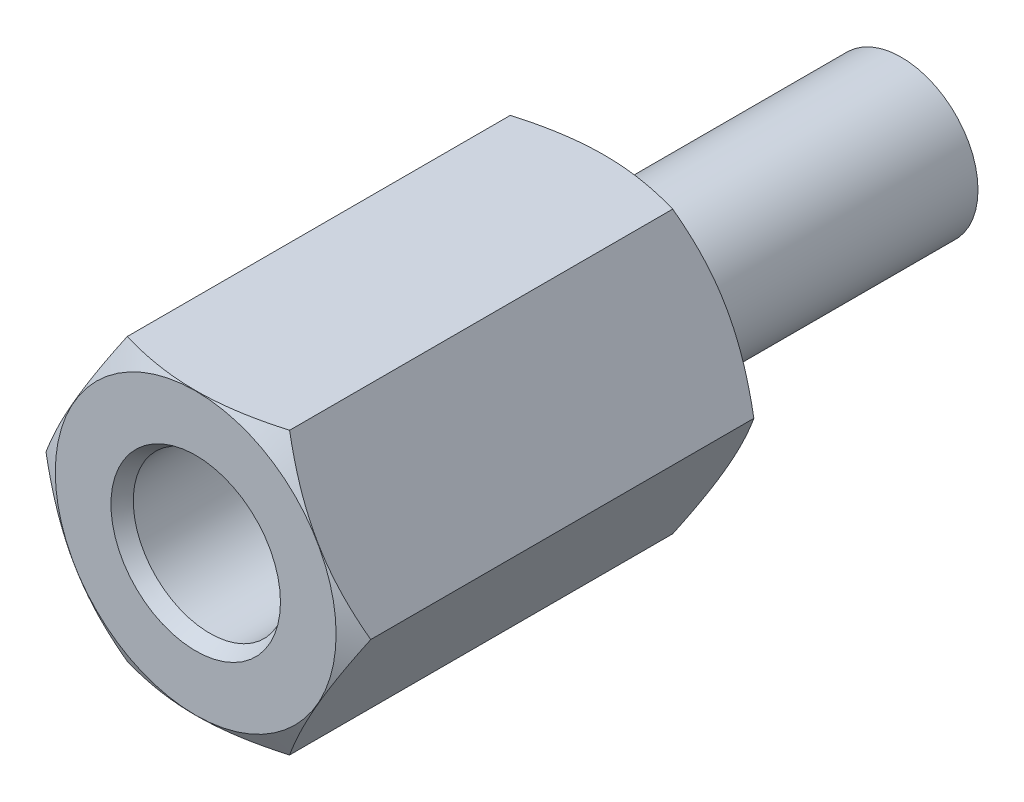
ISO-10303-21;
HEADER;
FILE_DESCRIPTION(('STEP AP214'),'2;1');
FILE_NAME('part.step','',(''),(''),'','','');
FILE_SCHEMA(('AUTOMOTIVE_DESIGN { 1 0 10303 214 1 1 1 1 }'));
ENDSEC;
DATA;
#1=APPLICATION_CONTEXT('core data for automotive mechanical design processes');
#2=APPLICATION_PROTOCOL_DEFINITION('international standard','automotive_design',2000,#1);
#3=PRODUCT_CONTEXT('',#1,'mechanical');
#4=PRODUCT('Part','Part','',(#3));
#5=PRODUCT_RELATED_PRODUCT_CATEGORY('part','',(#4));
#6=PRODUCT_DEFINITION_FORMATION('','',#4);
#7=PRODUCT_DEFINITION_CONTEXT('part definition',#1,'design');
#8=PRODUCT_DEFINITION('design','',#6,#7);
#9=PRODUCT_DEFINITION_SHAPE('','',#8);
#10=(LENGTH_UNIT() NAMED_UNIT(*) SI_UNIT(.MILLI.,.METRE.));
#11=(NAMED_UNIT(*) PLANE_ANGLE_UNIT() SI_UNIT($,.RADIAN.));
#12=(NAMED_UNIT(*) SI_UNIT($,.STERADIAN.) SOLID_ANGLE_UNIT());
#13=UNCERTAINTY_MEASURE_WITH_UNIT(LENGTH_MEASURE(1.E-05),#10,'distance_accuracy_value','');
#14=(GEOMETRIC_REPRESENTATION_CONTEXT(3) GLOBAL_UNCERTAINTY_ASSIGNED_CONTEXT((#13)) GLOBAL_UNIT_ASSIGNED_CONTEXT((#10,
#11,#12)) REPRESENTATION_CONTEXT('',''));
#15=CARTESIAN_POINT('',(0.,0.,0.));
#16=DIRECTION('',(0.,0.,1.));
#17=DIRECTION('',(1.,0.,0.));
#18=AXIS2_PLACEMENT_3D('',#15,#16,#17);
#19=CARTESIAN_POINT('',(0.,0.,5.58690872450008));
#20=DIRECTION('',(0.,0.,1.));
#21=DIRECTION('',(1.,0.,0.));
#22=AXIS2_PLACEMENT_3D('',#19,#20,#21);
#23=CONICAL_SURFACE('',#22,3.,1.047197551197);
#24=CARTESIAN_POINT('',(0.,0.,5.58690872450008));
#25=DIRECTION('',(0.,0.,1.));
#26=DIRECTION('',(1.,0.,0.));
#27=AXIS2_PLACEMENT_3D('',#24,#25,#26);
#28=CIRCLE('',#27,3.);
#29=CARTESIAN_POINT('',(3.00000000000009,0.,5.58690872450008));
#30=VERTEX_POINT('',#29);
#31=EDGE_CURVE('P0_E53',#30,#30,#28,.T.);
#32=ORIENTED_EDGE('',*,*,#31,.T.);
#33=DIRECTION('',(-0.866025403784329,0.,-0.50000000000019));
#34=VECTOR('',#33,1.);
#35=CARTESIAN_POINT('',(3.00000000000009,0.,5.58690872450008));
#36=LINE('',#35,#34);
#37=CARTESIAN_POINT('',(0.,0.,3.85485791693208));
#38=VERTEX_POINT('',#37);
#39=EDGE_CURVE('P0_E11',#30,#38,#36,.T.);
#40=ORIENTED_EDGE('',*,*,#39,.T.);
#41=ORIENTED_EDGE('',*,*,#39,.F.);
#42=EDGE_LOOP('',(#32,#40,#41));
#43=FACE_BOUND('',#42,.T.);
#44=ADVANCED_FACE('P0_F43',(#43),#23,.F.);
#45=CARTESIAN_POINT('',(0.,0.,-14.4130912754999));
#46=DIRECTION('',(0.,0.,1.));
#47=DIRECTION('',(1.,0.,0.));
#48=AXIS2_PLACEMENT_3D('',#45,#46,#47);
#49=PLANE('',#48);
#50=CARTESIAN_POINT('',(0.,0.,-14.4130912754999));
#51=DIRECTION('',(0.,0.,1.));
#52=DIRECTION('',(1.,0.,0.));
#53=AXIS2_PLACEMENT_3D('',#50,#51,#52);
#54=CIRCLE('',#53,2.38);
#55=CARTESIAN_POINT('',(2.38000000000009,0.,-14.4130912754999));
#56=VERTEX_POINT('',#55);
#57=EDGE_CURVE('P0_E218',#56,#56,#54,.T.);
#58=ORIENTED_EDGE('',*,*,#57,.F.);
#59=EDGE_LOOP('',(#58));
#60=FACE_BOUND('',#59,.T.);
#61=ADVANCED_FACE('P0_F275',(#60),#49,.F.);
#62=CARTESIAN_POINT('',(0.,0.,13.0326524660801));
#63=DIRECTION('',(0.,0.,-1.));
#64=DIRECTION('',(1.,0.,0.));
#65=AXIS2_PLACEMENT_3D('',#62,#63,#64);
#66=CYLINDRICAL_SURFACE('',#65,3.);
#67=CARTESIAN_POINT('',(0.,0.,13.0326524660801));
#68=DIRECTION('',(0.,0.,1.));
#69=DIRECTION('',(1.,0.,0.));
#70=AXIS2_PLACEMENT_3D('',#67,#68,#69);
#71=CIRCLE('',#70,3.);
#72=CARTESIAN_POINT('',(3.00000000000009,0.,13.0326524660801));
#73=VERTEX_POINT('',#72);
#74=EDGE_CURVE('P0_E223',#73,#73,#71,.T.);
#75=ORIENTED_EDGE('',*,*,#74,.T.);
#76=DIRECTION('',(0.,0.,-1.));
#77=VECTOR('',#76,1.);
#78=CARTESIAN_POINT('',(3.00000000000009,0.,13.0326524660801));
#79=LINE('',#78,#77);
#80=EDGE_CURVE('P0_E203',#73,#30,#79,.T.);
#81=ORIENTED_EDGE('',*,*,#80,.T.);
#82=ORIENTED_EDGE('',*,*,#31,.F.);
#83=ORIENTED_EDGE('',*,*,#80,.F.);
#84=EDGE_LOOP('',(#75,#81,#82,#83));
#85=FACE_BOUND('',#84,.T.);
#86=ADVANCED_FACE('P0_F277',(#85),#66,.F.);
#87=CARTESIAN_POINT('',(0.,0.,-14.4130912754999));
#88=DIRECTION('',(0.,0.,1.));
#89=DIRECTION('',(1.,0.,0.));
#90=AXIS2_PLACEMENT_3D('',#87,#88,#89);
#91=CONICAL_SURFACE('',#90,2.38,1.047197551197);
#92=ORIENTED_EDGE('',*,*,#57,.T.);
#93=DIRECTION('',(0.866025403784329,0.,0.50000000000019));
#94=VECTOR('',#93,1.);
#95=CARTESIAN_POINT('',(2.38000000000009,0.,-14.4130912754999));
#96=LINE('',#95,#94);
#97=CARTESIAN_POINT('',(3.00000000000009,0.,-14.0551341086019));
#98=VERTEX_POINT('',#97);
#99=EDGE_CURVE('P0_E77',#56,#98,#96,.T.);
#100=ORIENTED_EDGE('',*,*,#99,.T.);
#101=CARTESIAN_POINT('',(0.,0.,-14.0551341086019));
#102=DIRECTION('',(0.,0.,1.));
#103=DIRECTION('',(1.,0.,0.));
#104=AXIS2_PLACEMENT_3D('',#101,#102,#103);
#105=CIRCLE('',#104,3.);
#106=EDGE_CURVE('P0_E229',#98,#98,#105,.T.);
#107=ORIENTED_EDGE('',*,*,#106,.F.);
#108=ORIENTED_EDGE('',*,*,#99,.F.);
#109=EDGE_LOOP('',(#92,#100,#107,#108));
#110=FACE_BOUND('',#109,.T.);
#111=ADVANCED_FACE('P0_F272',(#110),#91,.T.);
#112=CARTESIAN_POINT('',(0.,0.,13.5869087245001));
#113=DIRECTION('',(0.,0.,1.));
#114=DIRECTION('',(1.,0.,0.));
#115=AXIS2_PLACEMENT_3D('',#112,#113,#114);
#116=CONICAL_SURFACE('',#115,3.32,0.523598775599);
#117=CARTESIAN_POINT('',(0.,0.,13.5869087245001));
#118=DIRECTION('',(0.,0.,1.));
#119=DIRECTION('',(1.,0.,0.));
#120=AXIS2_PLACEMENT_3D('',#117,#118,#119);
#121=CIRCLE('',#120,3.32);
#122=CARTESIAN_POINT('',(3.32000000000009,0.,13.5869087245001));
#123=VERTEX_POINT('',#122);
#124=EDGE_CURVE('P0_E236',#123,#123,#121,.T.);
#125=ORIENTED_EDGE('',*,*,#124,.T.);
#126=DIRECTION('',(-0.50000000000094,0.,-0.866025403783896));
#127=VECTOR('',#126,1.);
#128=CARTESIAN_POINT('',(3.32000000000009,0.,13.5869087245001));
#129=LINE('',#128,#127);
#130=EDGE_CURVE('P0_E88',#123,#73,#129,.T.);
#131=ORIENTED_EDGE('',*,*,#130,.T.);
#132=ORIENTED_EDGE('',*,*,#74,.F.);
#133=ORIENTED_EDGE('',*,*,#130,.F.);
#134=EDGE_LOOP('',(#125,#131,#132,#133));
#135=FACE_BOUND('',#134,.T.);
#136=ADVANCED_FACE('P0_F298',(#135),#116,.F.);
#137=CARTESIAN_POINT('',(0.,0.,-14.0551341086019));
#138=DIRECTION('',(0.,0.,1.));
#139=DIRECTION('',(1.,0.,0.));
#140=AXIS2_PLACEMENT_3D('',#137,#138,#139);
#141=CYLINDRICAL_SURFACE('',#140,3.);
#142=ORIENTED_EDGE('',*,*,#106,.T.);
#143=DIRECTION('',(0.,0.,1.));
#144=VECTOR('',#143,1.);
#145=CARTESIAN_POINT('',(3.00000000000009,0.,-14.0551341086019));
#146=LINE('',#145,#144);
#147=CARTESIAN_POINT('',(3.00000000000009,0.,-2.41309127549992));
#148=VERTEX_POINT('',#147);
#149=EDGE_CURVE('P0_E235',#98,#148,#146,.T.);
#150=ORIENTED_EDGE('',*,*,#149,.T.);
#151=CARTESIAN_POINT('',(0.,0.,-2.41309127549992));
#152=DIRECTION('',(0.,0.,1.));
#153=DIRECTION('',(1.,0.,0.));
#154=AXIS2_PLACEMENT_3D('',#151,#152,#153);
#155=CIRCLE('',#154,3.);
#156=EDGE_CURVE('P0_E185',#148,#148,#155,.T.);
#157=ORIENTED_EDGE('',*,*,#156,.F.);
#158=ORIENTED_EDGE('',*,*,#149,.F.);
#159=EDGE_LOOP('',(#142,#150,#157,#158));
#160=FACE_BOUND('',#159,.T.);
#161=ADVANCED_FACE('P0_F271',(#160),#141,.T.);
#162=CARTESIAN_POINT('',(0.,0.,13.5869087245001));
#163=DIRECTION('',(0.,0.,1.));
#164=DIRECTION('',(1.,0.,0.));
#165=AXIS2_PLACEMENT_3D('',#162,#163,#164);
#166=PLANE('',#165);
#167=ORIENTED_EDGE('',*,*,#124,.F.);
#168=EDGE_LOOP('',(#167));
#169=FACE_BOUND('',#168,.T.);
#170=CARTESIAN_POINT('',(0.,0.,13.5869087245001));
#171=DIRECTION('',(0.,0.,1.));
#172=DIRECTION('',(1.,0.,0.));
#173=AXIS2_PLACEMENT_3D('',#170,#171,#172);
#174=CIRCLE('',#173,5.5);
#175=CARTESIAN_POINT('',(5.50000000000009,0.,13.5869087245001));
#176=VERTEX_POINT('',#175);
#177=EDGE_CURVE('P0_E129',#176,#176,#174,.T.);
#178=ORIENTED_EDGE('',*,*,#177,.T.);
#179=EDGE_LOOP('',(#178));
#180=FACE_BOUND('',#179,.T.);
#181=ADVANCED_FACE('P0_F303',(#169,#180),#166,.T.);
#182=CARTESIAN_POINT('',(0.,0.,-2.41309127549992));
#183=DIRECTION('',(0.,0.,1.));
#184=DIRECTION('',(1.,0.,0.));
#185=AXIS2_PLACEMENT_3D('',#182,#183,#184);
#186=PLANE('',#185);
#187=CARTESIAN_POINT('',(0.,0.,-2.41309127549992));
#188=DIRECTION('',(0.,0.,1.));
#189=DIRECTION('',(1.,0.,0.));
#190=AXIS2_PLACEMENT_3D('',#187,#188,#189);
#191=CIRCLE('',#190,5.5);
#192=CARTESIAN_POINT('',(5.50000000000009,0.,-2.41309127549992));
#193=VERTEX_POINT('',#192);
#194=EDGE_CURVE('P0_E255',#193,#193,#191,.T.);
#195=ORIENTED_EDGE('',*,*,#194,.F.);
#196=EDGE_LOOP('',(#195));
#197=FACE_BOUND('',#196,.T.);
#198=ORIENTED_EDGE('',*,*,#156,.T.);
#199=EDGE_LOOP('',(#198));
#200=FACE_BOUND('',#199,.T.);
#201=ADVANCED_FACE('P0_F269',(#197,#200),#186,.F.);
#202=CARTESIAN_POINT('',(-3.17999999999991,-5.50792156807009,-22.4130912754999));
#203=DIRECTION('',(0.,1.,0.));
#204=DIRECTION('',(1.,0.,0.));
#205=AXIS2_PLACEMENT_3D('',#202,#203,#204);
#206=PLANE('',#205);
#207=DIRECTION('',(0.,0.,1.));
#208=VECTOR('',#207,1.);
#209=CARTESIAN_POINT('',(3.18000000000009,-5.50792156807009,-22.4130912754999));
#210=LINE('',#209,#208);
#211=CARTESIAN_POINT('',(3.18000000000009,-5.50792156806809,-1.91657004399592));
#212=VERTEX_POINT('',#211);
#213=CARTESIAN_POINT('',(3.18000000000009,-5.50792156806809,13.0903874929961));
#214=VERTEX_POINT('',#213);
#215=EDGE_CURVE('P0_E124',#212,#214,#210,.T.);
#216=ORIENTED_EDGE('',*,*,#215,.T.);
#217=CARTESIAN_POINT('',(3.1799999999996,-5.50792156807009,13.0903874929964));
#218=CARTESIAN_POINT('',(-1.50369532073518E-13,-5.50792156807008,14.0083744210074));
#219=CARTESIAN_POINT('',(-3.18000000000008,-5.50792156807009,13.0903874929962));
#220=(BOUNDED_CURVE() B_SPLINE_CURVE(2,(#217,#218,#219),.UNSPECIFIED.,.F.,
.F.) B_SPLINE_CURVE_WITH_KNOTS((3,3),(0.,1.),
.UNSPECIFIED.) CURVE() GEOMETRIC_REPRESENTATION_ITEM() RATIONAL_B_SPLINE_CURVE((1.,
1.15470053837919,1.)) REPRESENTATION_ITEM(''));
#221=CARTESIAN_POINT('',(-3.17999999999991,-5.50792156807009,13.0903874929961));
#222=VERTEX_POINT('',#221);
#223=EDGE_CURVE('P0_E225',#214,#222,#220,.T.);
#224=ORIENTED_EDGE('',*,*,#223,.T.);
#225=DIRECTION('',(0.,0.,1.));
#226=VECTOR('',#225,1.);
#227=CARTESIAN_POINT('',(-3.17999999999991,-5.50792156807009,-22.4130912754999));
#228=LINE('',#227,#226);
#229=CARTESIAN_POINT('',(-3.17999999999991,-5.50792156807009,-1.91657004399592));
#230=VERTEX_POINT('',#229);
#231=EDGE_CURVE('P0_E180',#230,#222,#228,.T.);
#232=ORIENTED_EDGE('',*,*,#231,.F.);
#233=CARTESIAN_POINT('',(-3.17999999999942,-5.50792156807009,-1.9165700439962));
#234=CARTESIAN_POINT('',(3.38128598761551E-13,-5.5079215680701,-2.83455697200725));
#235=CARTESIAN_POINT('',(3.18000000000025,-5.50792156807009,-1.91657004399601));
#236=(BOUNDED_CURVE() B_SPLINE_CURVE(2,(#233,#234,#235),.UNSPECIFIED.,.F.,
.F.) B_SPLINE_CURVE_WITH_KNOTS((3,3),(0.,1.),
.UNSPECIFIED.) CURVE() GEOMETRIC_REPRESENTATION_ITEM() RATIONAL_B_SPLINE_CURVE((1.,
1.15470053837918,1.)) REPRESENTATION_ITEM(''));
#237=EDGE_CURVE('P0_E166',#230,#212,#236,.T.);
#238=ORIENTED_EDGE('',*,*,#237,.T.);
#239=EDGE_LOOP('',(#216,#224,#232,#238));
#240=FACE_BOUND('',#239,.T.);
#241=ADVANCED_FACE('P0_F289',(#240),#206,.F.);
#242=CARTESIAN_POINT('',(-6.35999999999991,0.,-22.4130912754999));
#243=DIRECTION('',(0.866025403784329,0.50000000000019,0.));
#244=DIRECTION('',(0.,0.,-1.));
#245=AXIS2_PLACEMENT_3D('',#242,#243,#244);
#246=PLANE('',#245);
#247=ORIENTED_EDGE('',*,*,#231,.T.);
#248=CARTESIAN_POINT('',(-3.17999999999766,-5.50792156807111,13.0903874929949));
#249=CARTESIAN_POINT('',(-4.76999999999917,-2.75396078403536,14.008374421008));
#250=CARTESIAN_POINT('',(-6.3600000000002,-4.68467561103688E-13,13.0903874929961));
#251=(BOUNDED_CURVE() B_SPLINE_CURVE(2,(#248,#249,#250),.UNSPECIFIED.,.F.,
.F.) B_SPLINE_CURVE_WITH_KNOTS((3,3),(0.,1.),
.UNSPECIFIED.) CURVE() GEOMETRIC_REPRESENTATION_ITEM() RATIONAL_B_SPLINE_CURVE((1.,
1.15470053837944,1.)) REPRESENTATION_ITEM(''));
#252=CARTESIAN_POINT('',(-6.35999999999991,-2.49380339938255E-13,13.0903874929961));
#253=VERTEX_POINT('',#252);
#254=EDGE_CURVE('P0_E179',#222,#253,#251,.T.);
#255=ORIENTED_EDGE('',*,*,#254,.T.);
#256=DIRECTION('',(0.,0.,1.));
#257=VECTOR('',#256,1.);
#258=CARTESIAN_POINT('',(-6.35999999999991,0.,-22.4130912754999));
#259=LINE('',#258,#257);
#260=CARTESIAN_POINT('',(-6.35999999999991,-2.49126436646875E-13,-1.91657004399592));
#261=VERTEX_POINT('',#260);
#262=EDGE_CURVE('P0_E133',#261,#253,#259,.T.);
#263=ORIENTED_EDGE('',*,*,#262,.F.);
#264=CARTESIAN_POINT('',(-6.36000000000029,-3.12148159236466E-13,-1.91657004399584));
#265=CARTESIAN_POINT('',(-4.7699999999997,-2.75396078403444,-2.83455697200756));
#266=CARTESIAN_POINT('',(-3.179999999999,-5.50792156806879,-1.91657004399553));
#267=(BOUNDED_CURVE() B_SPLINE_CURVE(2,(#264,#265,#266),.UNSPECIFIED.,.F.,
.F.) B_SPLINE_CURVE_WITH_KNOTS((3,3),(0.,1.),
.UNSPECIFIED.) CURVE() GEOMETRIC_REPRESENTATION_ITEM() RATIONAL_B_SPLINE_CURVE((1.,
1.15470053837932,1.)) REPRESENTATION_ITEM(''));
#268=EDGE_CURVE('P0_E164',#261,#230,#267,.T.);
#269=ORIENTED_EDGE('',*,*,#268,.T.);
#270=EDGE_LOOP('',(#247,#255,#263,#269));
#271=FACE_BOUND('',#270,.T.);
#272=ADVANCED_FACE('P0_F286',(#271),#246,.F.);
#273=CARTESIAN_POINT('',(-3.17999999999991,5.50792156806991,-22.4130912754999));
#274=DIRECTION('',(0.866025403784329,-0.50000000000019,0.));
#275=DIRECTION('',(0.,0.,-1.));
#276=AXIS2_PLACEMENT_3D('',#273,#274,#275);
#277=PLANE('',#276);
#278=ORIENTED_EDGE('',*,*,#262,.T.);
#279=CARTESIAN_POINT('',(-6.36000000000056,-3.44566671555521E-13,13.0903874929958));
#280=CARTESIAN_POINT('',(-4.7699999999998,2.75396078403408,14.0083744210078));
#281=CARTESIAN_POINT('',(-3.179999999999,5.50792156806861,13.0903874929957));
#282=(BOUNDED_CURVE() B_SPLINE_CURVE(2,(#279,#280,#281),.UNSPECIFIED.,.F.,
.F.) B_SPLINE_CURVE_WITH_KNOTS((3,3),(0.,1.),
.UNSPECIFIED.) CURVE() GEOMETRIC_REPRESENTATION_ITEM() RATIONAL_B_SPLINE_CURVE((1.,
1.15470053837935,1.)) REPRESENTATION_ITEM(''));
#283=CARTESIAN_POINT('',(-3.17999999999991,5.50792156806991,13.0903874929961));
#284=VERTEX_POINT('',#283);
#285=EDGE_CURVE('P0_E145',#253,#284,#282,.T.);
#286=ORIENTED_EDGE('',*,*,#285,.T.);
#287=DIRECTION('',(0.,0.,1.));
#288=VECTOR('',#287,1.);
#289=CARTESIAN_POINT('',(-3.17999999999991,5.50792156806991,-22.4130912754999));
#290=LINE('',#289,#288);
#291=CARTESIAN_POINT('',(-3.17999999999991,5.50792156806991,-1.91657004399592));
#292=VERTEX_POINT('',#291);
#293=EDGE_CURVE('P0_E138',#292,#284,#290,.T.);
#294=ORIENTED_EDGE('',*,*,#293,.F.);
#295=CARTESIAN_POINT('',(-3.17999999999766,5.50792156807093,-1.91657004399476));
#296=CARTESIAN_POINT('',(-4.76999999999922,2.75396078403513,-2.83455697200785));
#297=CARTESIAN_POINT('',(-6.36000000000029,1.27944247724946E-13,-1.91657004399584));
#298=(BOUNDED_CURVE() B_SPLINE_CURVE(2,(#295,#296,#297),.UNSPECIFIED.,.F.,
.F.) B_SPLINE_CURVE_WITH_KNOTS((3,3),(0.,1.),
.UNSPECIFIED.) CURVE() GEOMETRIC_REPRESENTATION_ITEM() RATIONAL_B_SPLINE_CURVE((1.,
1.15470053837944,1.)) REPRESENTATION_ITEM(''));
#299=EDGE_CURVE('P0_E142',#292,#261,#298,.T.);
#300=ORIENTED_EDGE('',*,*,#299,.T.);
#301=EDGE_LOOP('',(#278,#286,#294,#300));
#302=FACE_BOUND('',#301,.T.);
#303=ADVANCED_FACE('P0_F140',(#302),#277,.F.);
#304=CARTESIAN_POINT('',(3.18000000000009,-5.50792156807009,-22.4130912754999));
#305=DIRECTION('',(-0.866025403784329,0.50000000000019,0.));
#306=DIRECTION('',(0.,0.,1.));
#307=AXIS2_PLACEMENT_3D('',#304,#305,#306);
#308=PLANE('',#307);
#309=DIRECTION('',(0.,0.,1.));
#310=VECTOR('',#309,1.);
#311=CARTESIAN_POINT('',(6.36000000000009,0.,-1.91657004399592));
#312=LINE('',#311,#310);
#313=CARTESIAN_POINT('',(6.36000000000009,0.,-1.91657004399592));
#314=VERTEX_POINT('',#313);
#315=CARTESIAN_POINT('',(6.36000000000009,0.,13.0903874929961));
#316=VERTEX_POINT('',#315);
#317=EDGE_CURVE('P0_E192',#314,#316,#312,.T.);
#318=ORIENTED_EDGE('',*,*,#317,.T.);
#319=CARTESIAN_POINT('',(6.36000000000061,0.,13.0903874929959));
#320=CARTESIAN_POINT('',(4.77000000000016,-2.75396078403397,14.0083744210076));
#321=CARTESIAN_POINT('',(3.17999999999975,-5.50792156806779,13.090387492996));
#322=(BOUNDED_CURVE() B_SPLINE_CURVE(2,(#319,#320,#321),.UNSPECIFIED.,.F.,
.F.) B_SPLINE_CURVE_WITH_KNOTS((3,3),(0.,1.),
.UNSPECIFIED.) CURVE() GEOMETRIC_REPRESENTATION_ITEM() RATIONAL_B_SPLINE_CURVE((1.,
1.15470053837928,1.)) REPRESENTATION_ITEM(''));
#323=EDGE_CURVE('P0_E198',#316,#214,#322,.T.);
#324=ORIENTED_EDGE('',*,*,#323,.T.);
#325=ORIENTED_EDGE('',*,*,#215,.F.);
#326=CARTESIAN_POINT('',(3.17999999999957,-5.5079215680681,-1.91657004399576));
#327=CARTESIAN_POINT('',(4.77000000000002,-2.75396078403421,-2.83455697200747));
#328=CARTESIAN_POINT('',(6.36000000000043,-3.89419681750377E-13,-1.91657004399587));
#329=(BOUNDED_CURVE() B_SPLINE_CURVE(2,(#326,#327,#328),.UNSPECIFIED.,.F.,
.F.) B_SPLINE_CURVE_WITH_KNOTS((3,3),(0.,1.),
.UNSPECIFIED.) CURVE() GEOMETRIC_REPRESENTATION_ITEM() RATIONAL_B_SPLINE_CURVE((1.,
1.15470053837928,1.)) REPRESENTATION_ITEM(''));
#330=EDGE_CURVE('P0_E257',#212,#314,#329,.T.);
#331=ORIENTED_EDGE('',*,*,#330,.T.);
#332=EDGE_LOOP('',(#318,#324,#325,#331));
#333=FACE_BOUND('',#332,.T.);
#334=ADVANCED_FACE('P0_F45',(#333),#308,.F.);
#335=CARTESIAN_POINT('',(0.,0.,13.0903874929961));
#336=DIRECTION('',(0.,0.,-1.));
#337=DIRECTION('',(1.,0.,0.));
#338=AXIS2_PLACEMENT_3D('',#335,#336,#337);
#339=CONICAL_SURFACE('',#338,6.36,1.047197551197);
#340=ORIENTED_EDGE('',*,*,#323,.F.);
#341=DIRECTION('',(-0.866025403784329,0.,0.50000000000019));
#342=VECTOR('',#341,1.);
#343=CARTESIAN_POINT('',(6.36000000000009,0.,13.0903874929961));
#344=LINE('',#343,#342);
#345=EDGE_CURVE('P0_E248',#316,#176,#344,.T.);
#346=ORIENTED_EDGE('',*,*,#345,.T.);
#347=ORIENTED_EDGE('',*,*,#177,.F.);
#348=ORIENTED_EDGE('',*,*,#345,.F.);
#349=CARTESIAN_POINT('',(3.17999999999957,5.50792156806792,13.0903874929959));
#350=CARTESIAN_POINT('',(4.77000000000003,2.75396078403402,14.0083744210076));
#351=CARTESIAN_POINT('',(6.36000000000043,2.09212573127507E-13,13.090387492996));
#352=(BOUNDED_CURVE() B_SPLINE_CURVE(2,(#349,#350,#351),.UNSPECIFIED.,.F.,
.F.) B_SPLINE_CURVE_WITH_KNOTS((3,3),(0.,1.),
.UNSPECIFIED.) CURVE() GEOMETRIC_REPRESENTATION_ITEM() RATIONAL_B_SPLINE_CURVE((1.,
1.15470053837928,1.)) REPRESENTATION_ITEM(''));
#353=CARTESIAN_POINT('',(3.18000000000009,5.50792156806791,13.0903874929961));
#354=VERTEX_POINT('',#353);
#355=EDGE_CURVE('P0_E187',#354,#316,#352,.T.);
#356=ORIENTED_EDGE('',*,*,#355,.F.);
#357=CARTESIAN_POINT('',(-3.17999999999942,5.50792156806991,13.0903874929964));
#358=CARTESIAN_POINT('',(3.3812859876155E-13,5.5079215680699,14.0083744210074));
#359=CARTESIAN_POINT('',(3.18000000000025,5.50792156806991,13.0903874929962));
#360=(BOUNDED_CURVE() B_SPLINE_CURVE(2,(#357,#358,#359),.UNSPECIFIED.,.F.,
.F.) B_SPLINE_CURVE_WITH_KNOTS((3,3),(0.,1.),
.UNSPECIFIED.) CURVE() GEOMETRIC_REPRESENTATION_ITEM() RATIONAL_B_SPLINE_CURVE((1.,
1.15470053837919,1.)) REPRESENTATION_ITEM(''));
#361=EDGE_CURVE('P0_E149',#284,#354,#360,.T.);
#362=ORIENTED_EDGE('',*,*,#361,.F.);
#363=ORIENTED_EDGE('',*,*,#285,.F.);
#364=ORIENTED_EDGE('',*,*,#254,.F.);
#365=ORIENTED_EDGE('',*,*,#223,.F.);
#366=EDGE_LOOP('',(#340,#346,#347,#348,#356,#362,#363,#364,#365));
#367=FACE_BOUND('',#366,.T.);
#368=ADVANCED_FACE('P0_F293',(#367),#339,.T.);
#369=CARTESIAN_POINT('',(3.18000000000009,5.50792156806991,-22.4130912754999));
#370=DIRECTION('',(0.,-1.,0.));
#371=DIRECTION('',(-1.,0.,0.));
#372=AXIS2_PLACEMENT_3D('',#369,#370,#371);
#373=PLANE('',#372);
#374=ORIENTED_EDGE('',*,*,#293,.T.);
#375=ORIENTED_EDGE('',*,*,#361,.T.);
#376=DIRECTION('',(0.,0.,1.));
#377=VECTOR('',#376,1.);
#378=CARTESIAN_POINT('',(3.18000000000009,5.50792156806991,-22.4130912754999));
#379=LINE('',#378,#377);
#380=CARTESIAN_POINT('',(3.18000000000009,5.50792156806791,-1.91657004399592));
#381=VERTEX_POINT('',#380);
#382=EDGE_CURVE('P0_E155',#381,#354,#379,.T.);
#383=ORIENTED_EDGE('',*,*,#382,.F.);
#384=CARTESIAN_POINT('',(3.1799999999996,5.50792156806991,-1.9165700439962));
#385=CARTESIAN_POINT('',(-1.51257710493219E-13,5.50792156806992,-2.83455697200725));
#386=CARTESIAN_POINT('',(-3.18000000000007,5.50792156806991,-1.91657004399601));
#387=(BOUNDED_CURVE() B_SPLINE_CURVE(2,(#384,#385,#386),.UNSPECIFIED.,.F.,
.F.) B_SPLINE_CURVE_WITH_KNOTS((3,3),(0.,1.),
.UNSPECIFIED.) CURVE() GEOMETRIC_REPRESENTATION_ITEM() RATIONAL_B_SPLINE_CURVE((1.,
1.15470053837918,1.)) REPRESENTATION_ITEM(''));
#388=EDGE_CURVE('P0_E150',#381,#292,#387,.T.);
#389=ORIENTED_EDGE('',*,*,#388,.T.);
#390=EDGE_LOOP('',(#374,#375,#383,#389));
#391=FACE_BOUND('',#390,.T.);
#392=ADVANCED_FACE('P0_F153',(#391),#373,.F.);
#393=CARTESIAN_POINT('',(0.,0.,-2.41309127549992));
#394=DIRECTION('',(0.,0.,1.));
#395=DIRECTION('',(1.,0.,0.));
#396=AXIS2_PLACEMENT_3D('',#393,#394,#395);
#397=CONICAL_SURFACE('',#396,5.5,1.047197551197);
#398=DIRECTION('',(0.866025403784329,0.,0.50000000000019));
#399=VECTOR('',#398,1.);
#400=CARTESIAN_POINT('',(5.50000000000009,0.,-2.41309127549992));
#401=LINE('',#400,#399);
#402=EDGE_CURVE('P0_E217',#193,#314,#401,.T.);
#403=ORIENTED_EDGE('',*,*,#402,.F.);
#404=ORIENTED_EDGE('',*,*,#194,.T.);
#405=ORIENTED_EDGE('',*,*,#402,.T.);
#406=ORIENTED_EDGE('',*,*,#330,.F.);
#407=ORIENTED_EDGE('',*,*,#237,.F.);
#408=ORIENTED_EDGE('',*,*,#268,.F.);
#409=ORIENTED_EDGE('',*,*,#299,.F.);
#410=ORIENTED_EDGE('',*,*,#388,.F.);
#411=CARTESIAN_POINT('',(6.36000000000061,-1.06978944285737E-13,-1.91657004399576));
#412=CARTESIAN_POINT('',(4.77000000000017,2.75396078403379,-2.83455697200747));
#413=CARTESIAN_POINT('',(3.17999999999975,5.50792156806761,-1.91657004399587));
#414=(BOUNDED_CURVE() B_SPLINE_CURVE(2,(#411,#412,#413),.UNSPECIFIED.,.F.,
.F.) B_SPLINE_CURVE_WITH_KNOTS((3,3),(0.,1.),
.UNSPECIFIED.) CURVE() GEOMETRIC_REPRESENTATION_ITEM() RATIONAL_B_SPLINE_CURVE((1.,
1.15470053837928,1.)) REPRESENTATION_ITEM(''));
#415=EDGE_CURVE('P0_E213',#314,#381,#414,.T.);
#416=ORIENTED_EDGE('',*,*,#415,.F.);
#417=EDGE_LOOP('',(#403,#404,#405,#406,#407,#408,#409,#410,#416));
#418=FACE_BOUND('',#417,.T.);
#419=ADVANCED_FACE('P0_F161',(#418),#397,.T.);
#420=CARTESIAN_POINT('',(6.36000000000009,0.,-22.4130912754999));
#421=DIRECTION('',(-0.866025403784329,-0.50000000000019,0.));
#422=DIRECTION('',(-0.50000000000019,0.866025403784329,0.));
#423=AXIS2_PLACEMENT_3D('',#420,#421,#422);
#424=PLANE('',#423);
#425=ORIENTED_EDGE('',*,*,#382,.T.);
#426=ORIENTED_EDGE('',*,*,#355,.T.);
#427=ORIENTED_EDGE('',*,*,#317,.F.);
#428=ORIENTED_EDGE('',*,*,#415,.T.);
#429=EDGE_LOOP('',(#425,#426,#427,#428));
#430=FACE_BOUND('',#429,.T.);
#431=ADVANCED_FACE('P0_F304',(#430),#424,.F.);
#432=CLOSED_SHELL('',(#44,#61,#86,#111,#136,#161,#181,#201,#241,#272,#303,#334,#368,#392,#419,#431));
#433=MANIFOLD_SOLID_BREP('P0_B2',#432);
#434=CARTESIAN_POINT('',(0.,0.,4.));
#435=DIRECTION('',(0.,0.,1.));
#436=DIRECTION('',(1.,0.,0.));
#437=AXIS2_PLACEMENT_3D('',#434,#435,#436);
#438=CONICAL_SURFACE('',#437,1.5,1.047197551197);
#439=CARTESIAN_POINT('',(0.,0.,4.));
#440=DIRECTION('',(0.,0.,1.));
#441=DIRECTION('',(1.,0.,0.));
#442=AXIS2_PLACEMENT_3D('',#439,#440,#441);
#443=CIRCLE('',#442,1.5);
#444=CARTESIAN_POINT('',(1.5,0.,4.));
#445=VERTEX_POINT('',#444);
#446=EDGE_CURVE('P1_E20',#445,#445,#443,.T.);
#447=ORIENTED_EDGE('',*,*,#446,.T.);
#448=DIRECTION('',(-0.866025403784329,0.,-0.50000000000019));
#449=VECTOR('',#448,1.);
#450=CARTESIAN_POINT('',(1.5,0.,4.));
#451=LINE('',#450,#449);
#452=CARTESIAN_POINT('',(0.,0.,3.133974596216));
#453=VERTEX_POINT('',#452);
#454=EDGE_CURVE('P1_E11',#445,#453,#451,.T.);
#455=ORIENTED_EDGE('',*,*,#454,.T.);
#456=ORIENTED_EDGE('',*,*,#454,.F.);
#457=EDGE_LOOP('',(#447,#455,#456));
#458=FACE_BOUND('',#457,.T.);
#459=ADVANCED_FACE('P1_F16',(#458),#438,.F.);
#460=CARTESIAN_POINT('',(0.,0.,-6.));
#461=DIRECTION('',(0.,0.,1.));
#462=DIRECTION('',(1.,0.,0.));
#463=AXIS2_PLACEMENT_3D('',#460,#461,#462);
#464=PLANE('',#463);
#465=CARTESIAN_POINT('',(0.,0.,-6.));
#466=DIRECTION('',(0.,0.,1.));
#467=DIRECTION('',(1.,0.,0.));
#468=AXIS2_PLACEMENT_3D('',#465,#466,#467);
#469=CIRCLE('',#468,1.19);
#470=CARTESIAN_POINT('',(1.19,0.,-6.));
#471=VERTEX_POINT('',#470);
#472=EDGE_CURVE('P1_E244',#471,#471,#469,.T.);
#473=ORIENTED_EDGE('',*,*,#472,.F.);
#474=EDGE_LOOP('',(#473));
#475=FACE_BOUND('',#474,.T.);
#476=ADVANCED_FACE('P1_F347',(#475),#464,.F.);
#477=CARTESIAN_POINT('',(0.,0.,7.72287187079));
#478=DIRECTION('',(0.,0.,-1.));
#479=DIRECTION('',(1.,0.,0.));
#480=AXIS2_PLACEMENT_3D('',#477,#478,#479);
#481=CYLINDRICAL_SURFACE('',#480,1.5);
#482=CARTESIAN_POINT('',(0.,0.,7.72287187079));
#483=DIRECTION('',(0.,0.,1.));
#484=DIRECTION('',(1.,0.,0.));
#485=AXIS2_PLACEMENT_3D('',#482,#483,#484);
#486=CIRCLE('',#485,1.5);
#487=CARTESIAN_POINT('',(1.5,0.,7.72287187079));
#488=VERTEX_POINT('',#487);
#489=EDGE_CURVE('P1_E247',#488,#488,#486,.T.);
#490=ORIENTED_EDGE('',*,*,#489,.T.);
#491=DIRECTION('',(0.,0.,-1.));
#492=VECTOR('',#491,1.);
#493=CARTESIAN_POINT('',(1.5,0.,7.72287187079));
#494=LINE('',#493,#492);
#495=EDGE_CURVE('P1_E216',#488,#445,#494,.T.);
#496=ORIENTED_EDGE('',*,*,#495,.T.);
#497=ORIENTED_EDGE('',*,*,#446,.F.);
#498=ORIENTED_EDGE('',*,*,#495,.F.);
#499=EDGE_LOOP('',(#490,#496,#497,#498));
#500=FACE_BOUND('',#499,.T.);
#501=ADVANCED_FACE('P1_F325',(#500),#481,.F.);
#502=CARTESIAN_POINT('',(0.,0.,-6.));
#503=DIRECTION('',(0.,0.,1.));
#504=DIRECTION('',(1.,0.,0.));
#505=AXIS2_PLACEMENT_3D('',#502,#503,#504);
#506=CONICAL_SURFACE('',#505,1.19,1.047197551197);
#507=ORIENTED_EDGE('',*,*,#472,.T.);
#508=DIRECTION('',(0.866025403784329,0.,0.50000000000019));
#509=VECTOR('',#508,1.);
#510=CARTESIAN_POINT('',(1.19,0.,-6.));
#511=LINE('',#510,#509);
#512=CARTESIAN_POINT('',(1.5,0.,-5.821021416551));
#513=VERTEX_POINT('',#512);
#514=EDGE_CURVE('P1_E59',#471,#513,#511,.T.);
#515=ORIENTED_EDGE('',*,*,#514,.T.);
#516=CARTESIAN_POINT('',(0.,0.,-5.821021416551));
#517=DIRECTION('',(0.,0.,1.));
#518=DIRECTION('',(1.,0.,0.));
#519=AXIS2_PLACEMENT_3D('',#516,#517,#518);
#520=CIRCLE('',#519,1.5);
#521=EDGE_CURVE('P1_E262',#513,#513,#520,.T.);
#522=ORIENTED_EDGE('',*,*,#521,.F.);
#523=ORIENTED_EDGE('',*,*,#514,.F.);
#524=EDGE_LOOP('',(#507,#515,#522,#523));
#525=FACE_BOUND('',#524,.T.);
#526=ADVANCED_FACE('P1_F357',(#525),#506,.T.);
#527=CARTESIAN_POINT('',(0.,0.,8.));
#528=DIRECTION('',(0.,0.,1.));
#529=DIRECTION('',(1.,0.,0.));
#530=AXIS2_PLACEMENT_3D('',#527,#528,#529);
#531=CONICAL_SURFACE('',#530,1.66,0.523598775599);
#532=CARTESIAN_POINT('',(0.,0.,8.));
#533=DIRECTION('',(0.,0.,1.));
#534=DIRECTION('',(1.,0.,0.));
#535=AXIS2_PLACEMENT_3D('',#532,#533,#534);
#536=CIRCLE('',#535,1.66);
#537=CARTESIAN_POINT('',(1.66,0.,8.));
#538=VERTEX_POINT('',#537);
#539=EDGE_CURVE('P1_E243',#538,#538,#536,.T.);
#540=ORIENTED_EDGE('',*,*,#539,.T.);
#541=DIRECTION('',(-0.50000000000094,0.,-0.866025403783896));
#542=VECTOR('',#541,1.);
#543=CARTESIAN_POINT('',(1.66,0.,8.));
#544=LINE('',#543,#542);
#545=EDGE_CURVE('P1_E74',#538,#488,#544,.T.);
#546=ORIENTED_EDGE('',*,*,#545,.T.);
#547=ORIENTED_EDGE('',*,*,#489,.F.);
#548=ORIENTED_EDGE('',*,*,#545,.F.);
#549=EDGE_LOOP('',(#540,#546,#547,#548));
#550=FACE_BOUND('',#549,.T.);
#551=ADVANCED_FACE('P1_F327',(#550),#531,.F.);
#552=CARTESIAN_POINT('',(0.,0.,-5.821021416551));
#553=DIRECTION('',(0.,0.,1.));
#554=DIRECTION('',(1.,0.,0.));
#555=AXIS2_PLACEMENT_3D('',#552,#553,#554);
#556=CYLINDRICAL_SURFACE('',#555,1.5);
#557=ORIENTED_EDGE('',*,*,#521,.T.);
#558=DIRECTION('',(0.,0.,1.));
#559=VECTOR('',#558,1.);
#560=CARTESIAN_POINT('',(1.5,0.,-5.821021416551));
#561=LINE('',#560,#559);
#562=CARTESIAN_POINT('',(1.5,0.,0.));
#563=VERTEX_POINT('',#562);
#564=EDGE_CURVE('P1_E250',#513,#563,#561,.T.);
#565=ORIENTED_EDGE('',*,*,#564,.T.);
#566=CARTESIAN_POINT('',(0.,0.,0.));
#567=DIRECTION('',(0.,0.,1.));
#568=DIRECTION('',(1.,0.,0.));
#569=AXIS2_PLACEMENT_3D('',#566,#567,#568);
#570=CIRCLE('',#569,1.5);
#571=EDGE_CURVE('P1_E195',#563,#563,#570,.T.);
#572=ORIENTED_EDGE('',*,*,#571,.F.);
#573=ORIENTED_EDGE('',*,*,#564,.F.);
#574=EDGE_LOOP('',(#557,#565,#572,#573));
#575=FACE_BOUND('',#574,.T.);
#576=ADVANCED_FACE('P1_F333',(#575),#556,.T.);
#577=CARTESIAN_POINT('',(0.,0.,8.));
#578=DIRECTION('',(0.,0.,1.));
#579=DIRECTION('',(1.,0.,0.));
#580=AXIS2_PLACEMENT_3D('',#577,#578,#579);
#581=PLANE('',#580);
#582=ORIENTED_EDGE('',*,*,#539,.F.);
#583=EDGE_LOOP('',(#582));
#584=FACE_BOUND('',#583,.T.);
#585=CARTESIAN_POINT('',(0.,0.,8.));
#586=DIRECTION('',(0.,0.,1.));
#587=DIRECTION('',(1.,0.,0.));
#588=AXIS2_PLACEMENT_3D('',#585,#586,#587);
#589=CIRCLE('',#588,2.75);
#590=CARTESIAN_POINT('',(2.75,0.,8.));
#591=VERTEX_POINT('',#590);
#592=EDGE_CURVE('P1_E127',#591,#591,#589,.T.);
#593=ORIENTED_EDGE('',*,*,#592,.T.);
#594=EDGE_LOOP('',(#593));
#595=FACE_BOUND('',#594,.T.);
#596=ADVANCED_FACE('P1_F330',(#584,#595),#581,.T.);
#597=CARTESIAN_POINT('',(0.,0.,0.));
#598=DIRECTION('',(0.,0.,1.));
#599=DIRECTION('',(1.,0.,0.));
#600=AXIS2_PLACEMENT_3D('',#597,#598,#599);
#601=PLANE('',#600);
#602=CARTESIAN_POINT('',(0.,0.,0.));
#603=DIRECTION('',(0.,0.,1.));
#604=DIRECTION('',(1.,0.,0.));
#605=AXIS2_PLACEMENT_3D('',#602,#603,#604);
#606=CIRCLE('',#605,2.75);
#607=CARTESIAN_POINT('',(2.75,0.,0.));
#608=VERTEX_POINT('',#607);
#609=EDGE_CURVE('P1_E254',#608,#608,#606,.T.);
#610=ORIENTED_EDGE('',*,*,#609,.F.);
#611=EDGE_LOOP('',(#610));
#612=FACE_BOUND('',#611,.T.);
#613=ORIENTED_EDGE('',*,*,#571,.T.);
#614=EDGE_LOOP('',(#613));
#615=FACE_BOUND('',#614,.T.);
#616=ADVANCED_FACE('P1_F332',(#612,#615),#601,.F.);
#617=CARTESIAN_POINT('',(-1.59,-2.753960784035,-10.));
#618=DIRECTION('',(0.,1.,0.));
#619=DIRECTION('',(1.,0.,0.));
#620=AXIS2_PLACEMENT_3D('',#617,#618,#619);
#621=PLANE('',#620);
#622=DIRECTION('',(0.,0.,1.));
#623=VECTOR('',#622,1.);
#624=CARTESIAN_POINT('',(1.59,-2.753960784035,-10.));
#625=LINE('',#624,#623);
#626=CARTESIAN_POINT('',(1.59,-2.753960784034,0.248260615752));
#627=VERTEX_POINT('',#626);
#628=CARTESIAN_POINT('',(1.59,-2.753960784034,7.751739384248));
#629=VERTEX_POINT('',#628);
#630=EDGE_CURVE('P1_E121',#627,#629,#625,.T.);
#631=ORIENTED_EDGE('',*,*,#630,.T.);
#632=CARTESIAN_POINT('',(1.58999999999975,-2.753960784035,7.75173938424814));
#633=CARTESIAN_POINT('',(-1.21680443498917E-13,-2.753960784035,8.21073284825365));
#634=CARTESIAN_POINT('',(-1.59000000000009,-2.753960784035,7.75173938424805));
#635=(BOUNDED_CURVE() B_SPLINE_CURVE(2,(#632,#633,#634),.UNSPECIFIED.,.F.,
.F.) B_SPLINE_CURVE_WITH_KNOTS((3,3),(0.,1.),
.UNSPECIFIED.) CURVE() GEOMETRIC_REPRESENTATION_ITEM() RATIONAL_B_SPLINE_CURVE((1.,
1.15470053837919,1.)) REPRESENTATION_ITEM(''));
#636=CARTESIAN_POINT('',(-1.59,-2.753960784035,7.751739384248));
#637=VERTEX_POINT('',#636);
#638=EDGE_CURVE('P1_E253',#629,#637,#635,.T.);
#639=ORIENTED_EDGE('',*,*,#638,.T.);
#640=DIRECTION('',(0.,0.,1.));
#641=VECTOR('',#640,1.);
#642=CARTESIAN_POINT('',(-1.59,-2.753960784035,-10.));
#643=LINE('',#642,#641);
#644=CARTESIAN_POINT('',(-1.59,-2.753960784035,0.248260615752));
#645=VERTEX_POINT('',#644);
#646=EDGE_CURVE('P1_E189',#645,#637,#643,.T.);
#647=ORIENTED_EDGE('',*,*,#646,.F.);
#648=CARTESIAN_POINT('',(-1.58999999999975,-2.753960784035,0.248260615751858));
#649=CARTESIAN_POINT('',(1.22568621918617E-13,-2.75396078403501,-0.210732848253664));
#650=CARTESIAN_POINT('',(1.59000000000008,-2.753960784035,0.248260615751953));
#651=(BOUNDED_CURVE() B_SPLINE_CURVE(2,(#648,#649,#650),.UNSPECIFIED.,.F.,
.F.) B_SPLINE_CURVE_WITH_KNOTS((3,3),(0.,1.),
.UNSPECIFIED.) CURVE() GEOMETRIC_REPRESENTATION_ITEM() RATIONAL_B_SPLINE_CURVE((1.,
1.15470053837918,1.)) REPRESENTATION_ITEM(''));
#652=EDGE_CURVE('P1_E175',#645,#627,#651,.T.);
#653=ORIENTED_EDGE('',*,*,#652,.T.);
#654=EDGE_LOOP('',(#631,#639,#647,#653));
#655=FACE_BOUND('',#654,.T.);
#656=ADVANCED_FACE('P1_F340',(#655),#621,.F.);
#657=CARTESIAN_POINT('',(-3.18,0.,-10.));
#658=DIRECTION('',(0.866025403784329,0.50000000000019,0.));
#659=DIRECTION('',(0.,0.,-1.));
#660=AXIS2_PLACEMENT_3D('',#657,#658,#659);
#661=PLANE('',#660);
#662=ORIENTED_EDGE('',*,*,#646,.T.);
#663=CARTESIAN_POINT('',(-1.58999999999887,-2.75396078403551,7.75173938424742));
#664=CARTESIAN_POINT('',(-2.38499999999963,-1.37698039201763,8.21073284825395));
#665=CARTESIAN_POINT('',(-3.18000000000014,-1.88737914186276E-13,7.75173938424799));
#666=(BOUNDED_CURVE() B_SPLINE_CURVE(2,(#663,#664,#665),.UNSPECIFIED.,.F.,
.F.) B_SPLINE_CURVE_WITH_KNOTS((3,3),(0.,1.),
.UNSPECIFIED.) CURVE() GEOMETRIC_REPRESENTATION_ITEM() RATIONAL_B_SPLINE_CURVE((1.,
1.15470053837944,1.)) REPRESENTATION_ITEM(''));
#667=CARTESIAN_POINT('',(-3.18,0.,7.751739384248));
#668=VERTEX_POINT('',#667);
#669=EDGE_CURVE('P1_E188',#637,#668,#666,.T.);
#670=ORIENTED_EDGE('',*,*,#669,.T.);
#671=DIRECTION('',(0.,0.,1.));
#672=VECTOR('',#671,1.);
#673=CARTESIAN_POINT('',(-3.18,0.,-10.));
#674=LINE('',#673,#672);
#675=CARTESIAN_POINT('',(-3.18,0.,0.248260615752));
#676=VERTEX_POINT('',#675);
#677=EDGE_CURVE('P1_E133',#676,#668,#674,.T.);
#678=ORIENTED_EDGE('',*,*,#677,.F.);
#679=CARTESIAN_POINT('',(-3.18000000000019,-1.10578213252666E-13,0.248260615752039));
#680=CARTESIAN_POINT('',(-2.3849999999999,-1.37698039201718,-0.210732848253821));
#681=CARTESIAN_POINT('',(-1.58999999999955,-2.75396078403435,0.248260615752193));
#682=(BOUNDED_CURVE() B_SPLINE_CURVE(2,(#679,#680,#681),.UNSPECIFIED.,.F.,
.F.) B_SPLINE_CURVE_WITH_KNOTS((3,3),(0.,1.),
.UNSPECIFIED.) CURVE() GEOMETRIC_REPRESENTATION_ITEM() RATIONAL_B_SPLINE_CURVE((1.,
1.15470053837932,1.)) REPRESENTATION_ITEM(''));
#683=EDGE_CURVE('P1_E168',#676,#645,#682,.T.);
#684=ORIENTED_EDGE('',*,*,#683,.T.);
#685=EDGE_LOOP('',(#662,#670,#678,#684));
#686=FACE_BOUND('',#685,.T.);
#687=ADVANCED_FACE('P1_F364',(#686),#661,.F.);
#688=CARTESIAN_POINT('',(-1.59,2.753960784035,-10.));
#689=DIRECTION('',(0.866025403784329,-0.50000000000019,0.));
#690=DIRECTION('',(0.,0.,-1.));
#691=AXIS2_PLACEMENT_3D('',#688,#689,#690);
#692=PLANE('',#691);
#693=ORIENTED_EDGE('',*,*,#677,.T.);
#694=CARTESIAN_POINT('',(-3.18000000000032,-1.26787469412193E-13,7.75173938424788));
#695=CARTESIAN_POINT('',(-2.38499999999995,1.37698039201708,8.21073284825385));
#696=CARTESIAN_POINT('',(-1.58999999999955,2.75396078403435,7.75173938424781));
#697=(BOUNDED_CURVE() B_SPLINE_CURVE(2,(#694,#695,#696),.UNSPECIFIED.,.F.,
.F.) B_SPLINE_CURVE_WITH_KNOTS((3,3),(0.,1.),
.UNSPECIFIED.) CURVE() GEOMETRIC_REPRESENTATION_ITEM() RATIONAL_B_SPLINE_CURVE((1.,
1.15470053837935,1.)) REPRESENTATION_ITEM(''));
#698=CARTESIAN_POINT('',(-1.59,2.753960784035,7.751739384248));
#699=VERTEX_POINT('',#698);
#700=EDGE_CURVE('P1_E148',#668,#699,#697,.T.);
#701=ORIENTED_EDGE('',*,*,#700,.T.);
#702=DIRECTION('',(0.,0.,1.));
#703=VECTOR('',#702,1.);
#704=CARTESIAN_POINT('',(-1.59,2.753960784035,-10.));
#705=LINE('',#704,#703);
#706=CARTESIAN_POINT('',(-1.59,2.753960784035,0.248260615752));
#707=VERTEX_POINT('',#706);
#708=EDGE_CURVE('P1_E141',#707,#699,#705,.T.);
#709=ORIENTED_EDGE('',*,*,#708,.F.);
#710=CARTESIAN_POINT('',(-1.58999999999887,2.75396078403551,0.248260615752579));
#711=CARTESIAN_POINT('',(-2.38499999999965,1.37698039201761,-0.210732848253967));
#712=CARTESIAN_POINT('',(-3.18000000000019,1.0946799022804E-13,0.24826061575204));
#713=(BOUNDED_CURVE() B_SPLINE_CURVE(2,(#710,#711,#712),.UNSPECIFIED.,.F.,
.F.) B_SPLINE_CURVE_WITH_KNOTS((3,3),(0.,1.),
.UNSPECIFIED.) CURVE() GEOMETRIC_REPRESENTATION_ITEM() RATIONAL_B_SPLINE_CURVE((1.,
1.15470053837944,1.)) REPRESENTATION_ITEM(''));
#714=EDGE_CURVE('P1_E145',#707,#676,#713,.T.);
#715=ORIENTED_EDGE('',*,*,#714,.T.);
#716=EDGE_LOOP('',(#693,#701,#709,#715));
#717=FACE_BOUND('',#716,.T.);
#718=ADVANCED_FACE('P1_F143',(#717),#692,.F.);
#719=CARTESIAN_POINT('',(1.59,-2.753960784035,-10.));
#720=DIRECTION('',(-0.866025403784329,0.50000000000019,0.));
#721=DIRECTION('',(0.,0.,1.));
#722=AXIS2_PLACEMENT_3D('',#719,#720,#721);
#723=PLANE('',#722);
#724=DIRECTION('',(0.,0.,1.));
#725=VECTOR('',#724,1.);
#726=CARTESIAN_POINT('',(3.18,0.,0.248260615752));
#727=LINE('',#726,#725);
#728=CARTESIAN_POINT('',(3.18,0.,0.248260615752));
#729=VERTEX_POINT('',#728);
#730=CARTESIAN_POINT('',(3.18,0.,7.751739384248));
#731=VERTEX_POINT('',#730);
#732=EDGE_CURVE('P1_E204',#729,#731,#727,.T.);
#733=ORIENTED_EDGE('',*,*,#732,.T.);
#734=CARTESIAN_POINT('',(3.18000000000026,0.,7.75173938424792));
#735=CARTESIAN_POINT('',(2.38500000000003,-1.37698039201694,8.21073284825377));
#736=CARTESIAN_POINT('',(1.58999999999983,-2.75396078403385,7.75173938424797));
#737=(BOUNDED_CURVE() B_SPLINE_CURVE(2,(#734,#735,#736),.UNSPECIFIED.,.F.,
.F.) B_SPLINE_CURVE_WITH_KNOTS((3,3),(0.,1.),
.UNSPECIFIED.) CURVE() GEOMETRIC_REPRESENTATION_ITEM() RATIONAL_B_SPLINE_CURVE((1.,
1.15470053837928,1.)) REPRESENTATION_ITEM(''));
#738=EDGE_CURVE('P1_E211',#731,#629,#737,.T.);
#739=ORIENTED_EDGE('',*,*,#738,.T.);
#740=ORIENTED_EDGE('',*,*,#630,.F.);
#741=CARTESIAN_POINT('',(1.58999999999974,-2.75396078403401,0.248260615752079));
#742=CARTESIAN_POINT('',(2.38499999999996,-1.37698039201706,-0.210732848253774));
#743=CARTESIAN_POINT('',(3.18000000000017,-1.49213974509621E-13,0.248260615752026));
#744=(BOUNDED_CURVE() B_SPLINE_CURVE(2,(#741,#742,#743),.UNSPECIFIED.,.F.,
.F.) B_SPLINE_CURVE_WITH_KNOTS((3,3),(0.,1.),
.UNSPECIFIED.) CURVE() GEOMETRIC_REPRESENTATION_ITEM() RATIONAL_B_SPLINE_CURVE((1.,
1.15470053837928,1.)) REPRESENTATION_ITEM(''));
#745=EDGE_CURVE('P1_E257',#627,#729,#744,.T.);
#746=ORIENTED_EDGE('',*,*,#745,.T.);
#747=EDGE_LOOP('',(#733,#739,#740,#746));
#748=FACE_BOUND('',#747,.T.);
#749=ADVANCED_FACE('P1_F18',(#748),#723,.F.);
#750=CARTESIAN_POINT('',(0.,0.,7.751739384248));
#751=DIRECTION('',(0.,0.,-1.));
#752=DIRECTION('',(1.,0.,0.));
#753=AXIS2_PLACEMENT_3D('',#750,#751,#752);
#754=CONICAL_SURFACE('',#753,3.18,1.047197551197);
#755=ORIENTED_EDGE('',*,*,#738,.F.);
#756=DIRECTION('',(-0.866025403784329,0.,0.50000000000019));
#757=VECTOR('',#756,1.);
#758=CARTESIAN_POINT('',(3.18,0.,7.751739384248));
#759=LINE('',#758,#757);
#760=EDGE_CURVE('P1_E227',#731,#591,#759,.T.);
#761=ORIENTED_EDGE('',*,*,#760,.T.);
#762=ORIENTED_EDGE('',*,*,#592,.F.);
#763=ORIENTED_EDGE('',*,*,#760,.F.);
#764=CARTESIAN_POINT('',(1.58999999999974,2.75396078403401,7.75173938424792));
#765=CARTESIAN_POINT('',(2.38499999999997,1.37698039201706,8.21073284825377));
#766=CARTESIAN_POINT('',(3.18000000000017,1.50102152929321E-13,7.75173938424797));
#767=(BOUNDED_CURVE() B_SPLINE_CURVE(2,(#764,#765,#766),.UNSPECIFIED.,.F.,
.F.) B_SPLINE_CURVE_WITH_KNOTS((3,3),(0.,1.),
.UNSPECIFIED.) CURVE() GEOMETRIC_REPRESENTATION_ITEM() RATIONAL_B_SPLINE_CURVE((1.,
1.15470053837928,1.)) REPRESENTATION_ITEM(''));
#768=CARTESIAN_POINT('',(1.59,2.753960784034,7.751739384248));
#769=VERTEX_POINT('',#768);
#770=EDGE_CURVE('P1_E198',#769,#731,#767,.T.);
#771=ORIENTED_EDGE('',*,*,#770,.F.);
#772=CARTESIAN_POINT('',(-1.58999999999975,2.753960784035,7.75173938424814));
#773=CARTESIAN_POINT('',(1.22568621918617E-13,2.753960784035,8.21073284825365));
#774=CARTESIAN_POINT('',(1.59000000000008,2.753960784035,7.75173938424805));
#775=(BOUNDED_CURVE() B_SPLINE_CURVE(2,(#772,#773,#774),.UNSPECIFIED.,.F.,
.F.) B_SPLINE_CURVE_WITH_KNOTS((3,3),(0.,1.),
.UNSPECIFIED.) CURVE() GEOMETRIC_REPRESENTATION_ITEM() RATIONAL_B_SPLINE_CURVE((1.,
1.15470053837919,1.)) REPRESENTATION_ITEM(''));
#776=EDGE_CURVE('P1_E152',#699,#769,#775,.T.);
#777=ORIENTED_EDGE('',*,*,#776,.F.);
#778=ORIENTED_EDGE('',*,*,#700,.F.);
#779=ORIENTED_EDGE('',*,*,#669,.F.);
#780=ORIENTED_EDGE('',*,*,#638,.F.);
#781=EDGE_LOOP('',(#755,#761,#762,#763,#771,#777,#778,#779,#780));
#782=FACE_BOUND('',#781,.T.);
#783=ADVANCED_FACE('P1_F367',(#782),#754,.T.);
#784=CARTESIAN_POINT('',(1.59,2.753960784035,-10.));
#785=DIRECTION('',(0.,-1.,0.));
#786=DIRECTION('',(-1.,0.,0.));
#787=AXIS2_PLACEMENT_3D('',#784,#785,#786);
#788=PLANE('',#787);
#789=ORIENTED_EDGE('',*,*,#708,.T.);
#790=ORIENTED_EDGE('',*,*,#776,.T.);
#791=DIRECTION('',(0.,0.,1.));
#792=VECTOR('',#791,1.);
#793=CARTESIAN_POINT('',(1.59,2.753960784035,-10.));
#794=LINE('',#793,#792);
#795=CARTESIAN_POINT('',(1.59,2.753960784034,0.248260615752));
#796=VERTEX_POINT('',#795);
#797=EDGE_CURVE('P1_E158',#796,#769,#794,.T.);
#798=ORIENTED_EDGE('',*,*,#797,.F.);
#799=CARTESIAN_POINT('',(1.58999999999975,2.753960784035,0.248260615751858));
#800=CARTESIAN_POINT('',(-1.22124532708767E-13,2.75396078403501,-0.210732848253664));
#801=CARTESIAN_POINT('',(-1.59000000000008,2.753960784035,0.248260615751953));
#802=(BOUNDED_CURVE() B_SPLINE_CURVE(2,(#799,#800,#801),.UNSPECIFIED.,.F.,
.F.) B_SPLINE_CURVE_WITH_KNOTS((3,3),(0.,1.),
.UNSPECIFIED.) CURVE() GEOMETRIC_REPRESENTATION_ITEM() RATIONAL_B_SPLINE_CURVE((1.,
1.15470053837918,1.)) REPRESENTATION_ITEM(''));
#803=EDGE_CURVE('P1_E153',#796,#707,#802,.T.);
#804=ORIENTED_EDGE('',*,*,#803,.T.);
#805=EDGE_LOOP('',(#789,#790,#798,#804));
#806=FACE_BOUND('',#805,.T.);
#807=ADVANCED_FACE('P1_F156',(#806),#788,.F.);
#808=CARTESIAN_POINT('',(0.,0.,0.));
#809=DIRECTION('',(0.,0.,1.));
#810=DIRECTION('',(1.,0.,0.));
#811=AXIS2_PLACEMENT_3D('',#808,#809,#810);
#812=CONICAL_SURFACE('',#811,2.75,1.047197551197);
#813=DIRECTION('',(0.866025403784329,0.,0.50000000000019));
#814=VECTOR('',#813,1.);
#815=CARTESIAN_POINT('',(2.75,0.,0.));
#816=LINE('',#815,#814);
#817=EDGE_CURVE('P1_E236',#608,#729,#816,.T.);
#818=ORIENTED_EDGE('',*,*,#817,.F.);
#819=ORIENTED_EDGE('',*,*,#609,.T.);
#820=ORIENTED_EDGE('',*,*,#817,.T.);
#821=ORIENTED_EDGE('',*,*,#745,.F.);
#822=ORIENTED_EDGE('',*,*,#652,.F.);
#823=ORIENTED_EDGE('',*,*,#683,.F.);
#824=ORIENTED_EDGE('',*,*,#714,.F.);
#825=ORIENTED_EDGE('',*,*,#803,.F.);
#826=CARTESIAN_POINT('',(3.18000000000026,0.,0.248260615752079));
#827=CARTESIAN_POINT('',(2.38500000000004,1.37698039201694,-0.210732848253774));
#828=CARTESIAN_POINT('',(1.58999999999983,2.75396078403385,0.248260615752026));
#829=(BOUNDED_CURVE() B_SPLINE_CURVE(2,(#826,#827,#828),.UNSPECIFIED.,.F.,
.F.) B_SPLINE_CURVE_WITH_KNOTS((3,3),(0.,1.),
.UNSPECIFIED.) CURVE() GEOMETRIC_REPRESENTATION_ITEM() RATIONAL_B_SPLINE_CURVE((1.,
1.15470053837928,1.)) REPRESENTATION_ITEM(''));
#830=EDGE_CURVE('P1_E231',#729,#796,#829,.T.);
#831=ORIENTED_EDGE('',*,*,#830,.F.);
#832=EDGE_LOOP('',(#818,#819,#820,#821,#822,#823,#824,#825,#831));
#833=FACE_BOUND('',#832,.T.);
#834=ADVANCED_FACE('P1_F165',(#833),#812,.T.);
#835=CARTESIAN_POINT('',(3.18,0.,-10.));
#836=DIRECTION('',(-0.866025403784329,-0.50000000000019,0.));
#837=DIRECTION('',(-0.50000000000019,0.866025403784329,0.));
#838=AXIS2_PLACEMENT_3D('',#835,#836,#837);
#839=PLANE('',#838);
#840=ORIENTED_EDGE('',*,*,#797,.T.);
#841=ORIENTED_EDGE('',*,*,#770,.T.);
#842=ORIENTED_EDGE('',*,*,#732,.F.);
#843=ORIENTED_EDGE('',*,*,#830,.T.);
#844=EDGE_LOOP('',(#840,#841,#842,#843));
#845=FACE_BOUND('',#844,.T.);
#846=ADVANCED_FACE('P1_F276',(#845),#839,.F.);
#847=CLOSED_SHELL('',(#459,#476,#501,#526,#551,#576,#596,#616,#656,#687,#718,#749,#783,#807,
#834,#846));
#848=MANIFOLD_SOLID_BREP('P1_B1',#847);
#849=ADVANCED_BREP_SHAPE_REPRESENTATION('',(#18,#433,#848),#14);
#850=SHAPE_DEFINITION_REPRESENTATION(#9,#849);
ENDSEC;
END-ISO-10303-21;
